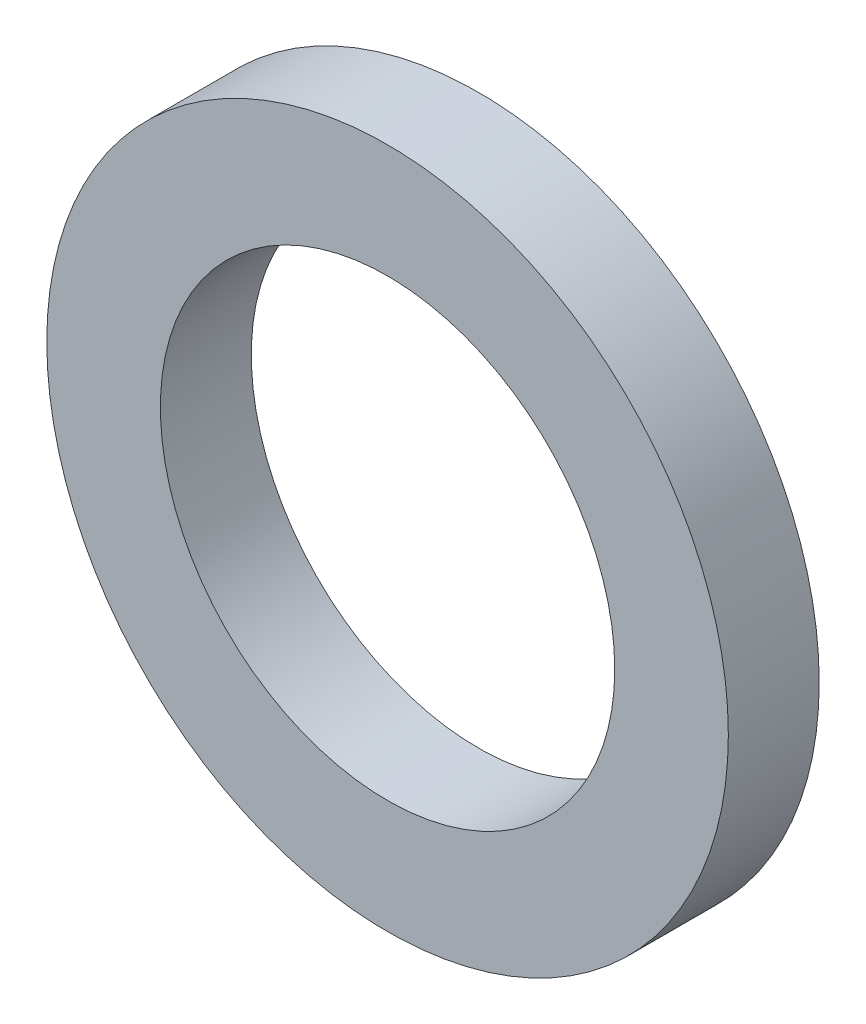
ISO-10303-21;
HEADER;
FILE_DESCRIPTION(('STEP AP214'),'2;1');
FILE_NAME('part.step','',(''),(''),'','','');
FILE_SCHEMA(('AUTOMOTIVE_DESIGN { 1 0 10303 214 1 1 1 1 }'));
ENDSEC;
DATA;
#1=APPLICATION_CONTEXT('core data for automotive mechanical design processes');
#2=APPLICATION_PROTOCOL_DEFINITION('international standard','automotive_design',2000,#1);
#3=PRODUCT_CONTEXT('',#1,'mechanical');
#4=PRODUCT('Part','Part','',(#3));
#5=PRODUCT_RELATED_PRODUCT_CATEGORY('part','',(#4));
#6=PRODUCT_DEFINITION_FORMATION('','',#4);
#7=PRODUCT_DEFINITION_CONTEXT('part definition',#1,'design');
#8=PRODUCT_DEFINITION('design','',#6,#7);
#9=PRODUCT_DEFINITION_SHAPE('','',#8);
#10=(LENGTH_UNIT() NAMED_UNIT(*) SI_UNIT(.MILLI.,.METRE.));
#11=(NAMED_UNIT(*) PLANE_ANGLE_UNIT() SI_UNIT($,.RADIAN.));
#12=(NAMED_UNIT(*) SI_UNIT($,.STERADIAN.) SOLID_ANGLE_UNIT());
#13=UNCERTAINTY_MEASURE_WITH_UNIT(LENGTH_MEASURE(1.E-05),#10,'distance_accuracy_value','');
#14=(GEOMETRIC_REPRESENTATION_CONTEXT(3) GLOBAL_UNCERTAINTY_ASSIGNED_CONTEXT((#13)) GLOBAL_UNIT_ASSIGNED_CONTEXT((#10,
#11,#12)) REPRESENTATION_CONTEXT('',''));
#15=CARTESIAN_POINT('',(0.,0.,0.));
#16=DIRECTION('',(0.,0.,1.));
#17=DIRECTION('',(1.,0.,0.));
#18=AXIS2_PLACEMENT_3D('',#15,#16,#17);
#19=CARTESIAN_POINT('',(0.,0.,4.));
#20=DIRECTION('',(0.,0.,1.));
#21=DIRECTION('',(1.,0.,0.));
#22=AXIS2_PLACEMENT_3D('',#19,#20,#21);
#23=PLANE('',#22);
#24=CARTESIAN_POINT('',(0.,0.,4.));
#25=DIRECTION('',(0.,0.,1.));
#26=DIRECTION('',(1.,0.,0.));
#27=AXIS2_PLACEMENT_3D('',#24,#25,#26);
#28=CIRCLE('',#27,15.);
#29=CARTESIAN_POINT('',(15.,0.,4.));
#30=VERTEX_POINT('',#29);
#31=EDGE_CURVE('E10',#30,#30,#28,.T.);
#32=ORIENTED_EDGE('',*,*,#31,.T.);
#33=EDGE_LOOP('',(#32));
#34=FACE_BOUND('',#33,.T.);
#35=CARTESIAN_POINT('',(0.,0.,4.));
#36=DIRECTION('',(0.,0.,1.));
#37=DIRECTION('',(1.,0.,0.));
#38=AXIS2_PLACEMENT_3D('',#35,#36,#37);
#39=CIRCLE('',#38,10.);
#40=CARTESIAN_POINT('',(10.,0.,4.));
#41=VERTEX_POINT('',#40);
#42=EDGE_CURVE('E56',#41,#41,#39,.T.);
#43=ORIENTED_EDGE('',*,*,#42,.F.);
#44=EDGE_LOOP('',(#43));
#45=FACE_BOUND('',#44,.T.);
#46=ADVANCED_FACE('F43',(#34,#45),#23,.T.);
#47=CARTESIAN_POINT('',(0.,0.,0.));
#48=DIRECTION('',(0.,0.,1.));
#49=DIRECTION('',(1.,0.,0.));
#50=AXIS2_PLACEMENT_3D('',#47,#48,#49);
#51=PLANE('',#50);
#52=CARTESIAN_POINT('',(0.,0.,0.));
#53=DIRECTION('',(0.,0.,1.));
#54=DIRECTION('',(1.,0.,0.));
#55=AXIS2_PLACEMENT_3D('',#52,#53,#54);
#56=CIRCLE('',#55,15.);
#57=CARTESIAN_POINT('',(15.,0.,0.));
#58=VERTEX_POINT('',#57);
#59=EDGE_CURVE('E47',#58,#58,#56,.T.);
#60=ORIENTED_EDGE('',*,*,#59,.F.);
#61=EDGE_LOOP('',(#60));
#62=FACE_BOUND('',#61,.T.);
#63=CARTESIAN_POINT('',(0.,0.,0.));
#64=DIRECTION('',(0.,0.,1.));
#65=DIRECTION('',(1.,0.,0.));
#66=AXIS2_PLACEMENT_3D('',#63,#64,#65);
#67=CIRCLE('',#66,10.);
#68=CARTESIAN_POINT('',(10.,0.,0.));
#69=VERTEX_POINT('',#68);
#70=EDGE_CURVE('E58',#69,#69,#67,.T.);
#71=ORIENTED_EDGE('',*,*,#70,.T.);
#72=EDGE_LOOP('',(#71));
#73=FACE_BOUND('',#72,.T.);
#74=ADVANCED_FACE('F70',(#62,#73),#51,.F.);
#75=CARTESIAN_POINT('',(0.,0.,4.));
#76=DIRECTION('',(0.,0.,-1.));
#77=DIRECTION('',(-1.,0.,0.));
#78=AXIS2_PLACEMENT_3D('',#75,#76,#77);
#79=CYLINDRICAL_SURFACE('',#78,15.);
#80=ORIENTED_EDGE('',*,*,#31,.F.);
#81=EDGE_LOOP('',(#80));
#82=FACE_BOUND('',#81,.T.);
#83=ORIENTED_EDGE('',*,*,#59,.T.);
#84=EDGE_LOOP('',(#83));
#85=FACE_BOUND('',#84,.T.);
#86=ADVANCED_FACE('F45',(#82,#85),#79,.T.);
#87=CARTESIAN_POINT('',(0.,0.,4.));
#88=DIRECTION('',(0.,0.,-1.));
#89=DIRECTION('',(-1.,0.,0.));
#90=AXIS2_PLACEMENT_3D('',#87,#88,#89);
#91=CYLINDRICAL_SURFACE('',#90,10.);
#92=ORIENTED_EDGE('',*,*,#42,.T.);
#93=EDGE_LOOP('',(#92));
#94=FACE_BOUND('',#93,.T.);
#95=ORIENTED_EDGE('',*,*,#70,.F.);
#96=EDGE_LOOP('',(#95));
#97=FACE_BOUND('',#96,.T.);
#98=ADVANCED_FACE('F66',(#94,#97),#91,.F.);
#99=CLOSED_SHELL('',(#46,#74,#86,#98));
#100=MANIFOLD_SOLID_BREP('B2',#99);
#101=ADVANCED_BREP_SHAPE_REPRESENTATION('',(#18,#100),#14);
#102=SHAPE_DEFINITION_REPRESENTATION(#9,#101);
ENDSEC;
END-ISO-10303-21;
